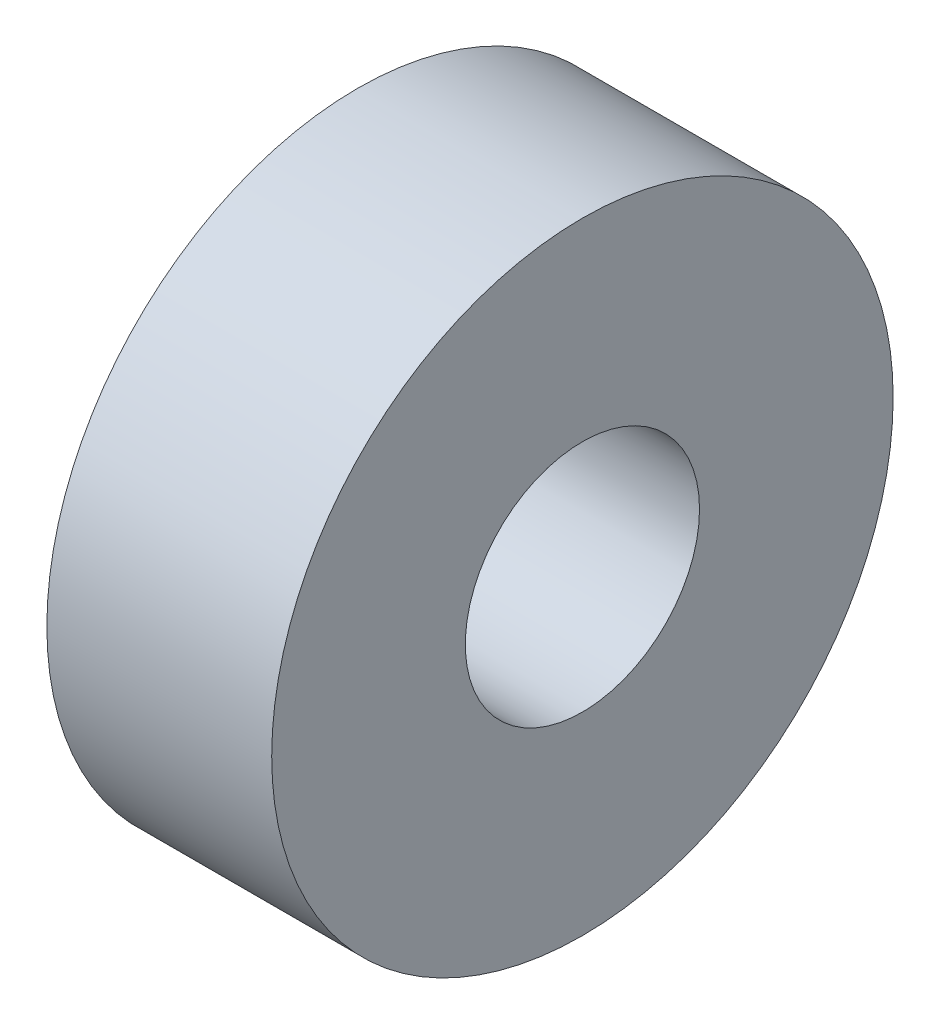
ISO-10303-21;
HEADER;
FILE_DESCRIPTION(('STEP AP214'),'2;1');
FILE_NAME('part.step','',(''),(''),'','','');
FILE_SCHEMA(('AUTOMOTIVE_DESIGN { 1 0 10303 214 1 1 1 1 }'));
ENDSEC;
DATA;
#1=APPLICATION_CONTEXT('core data for automotive mechanical design processes');
#2=APPLICATION_PROTOCOL_DEFINITION('international standard','automotive_design',2000,#1);
#3=PRODUCT_CONTEXT('',#1,'mechanical');
#4=PRODUCT('Part','Part','',(#3));
#5=PRODUCT_RELATED_PRODUCT_CATEGORY('part','',(#4));
#6=PRODUCT_DEFINITION_FORMATION('','',#4);
#7=PRODUCT_DEFINITION_CONTEXT('part definition',#1,'design');
#8=PRODUCT_DEFINITION('design','',#6,#7);
#9=PRODUCT_DEFINITION_SHAPE('','',#8);
#10=(LENGTH_UNIT() NAMED_UNIT(*) SI_UNIT(.MILLI.,.METRE.));
#11=(NAMED_UNIT(*) PLANE_ANGLE_UNIT() SI_UNIT($,.RADIAN.));
#12=(NAMED_UNIT(*) SI_UNIT($,.STERADIAN.) SOLID_ANGLE_UNIT());
#13=UNCERTAINTY_MEASURE_WITH_UNIT(LENGTH_MEASURE(1.E-05),#10,'distance_accuracy_value','');
#14=(GEOMETRIC_REPRESENTATION_CONTEXT(3) GLOBAL_UNCERTAINTY_ASSIGNED_CONTEXT((#13)) GLOBAL_UNIT_ASSIGNED_CONTEXT((#10,
#11,#12)) REPRESENTATION_CONTEXT('',''));
#15=CARTESIAN_POINT('',(0.,0.,0.));
#16=DIRECTION('',(0.,0.,1.));
#17=DIRECTION('',(1.,0.,0.));
#18=AXIS2_PLACEMENT_3D('',#15,#16,#17);
#19=CARTESIAN_POINT('',(9.144,14.7910672197327,30.6481001758243));
#20=DIRECTION('',(-1.,0.,0.));
#21=DIRECTION('',(0.,0.,1.));
#22=AXIS2_PLACEMENT_3D('',#19,#20,#21);
#23=CYLINDRICAL_SURFACE('',#22,12.6365);
#24=CARTESIAN_POINT('',(9.144,14.7910672197327,30.6481001758243));
#25=DIRECTION('',(1.,0.,0.));
#26=DIRECTION('',(0.,0.,-1.));
#27=AXIS2_PLACEMENT_3D('',#24,#25,#26);
#28=CIRCLE('',#27,12.6365);
#29=CARTESIAN_POINT('',(9.144,14.7910672197327,18.0116001758243));
#30=VERTEX_POINT('',#29);
#31=EDGE_CURVE('E10',#30,#30,#28,.T.);
#32=ORIENTED_EDGE('',*,*,#31,.F.);
#33=EDGE_LOOP('',(#32));
#34=FACE_BOUND('',#33,.T.);
#35=CARTESIAN_POINT('',(0.,14.7910672197327,30.6481001758243));
#36=DIRECTION('',(1.,0.,0.));
#37=DIRECTION('',(0.,0.,-1.));
#38=AXIS2_PLACEMENT_3D('',#35,#36,#37);
#39=CIRCLE('',#38,12.6365);
#40=CARTESIAN_POINT('',(0.,14.7910672197327,18.0116001758243));
#41=VERTEX_POINT('',#40);
#42=EDGE_CURVE('E38',#41,#41,#39,.T.);
#43=ORIENTED_EDGE('',*,*,#42,.T.);
#44=EDGE_LOOP('',(#43));
#45=FACE_BOUND('',#44,.T.);
#46=ADVANCED_FACE('F35',(#34,#45),#23,.T.);
#47=CARTESIAN_POINT('',(9.144,14.7910672197327,30.6481001758243));
#48=DIRECTION('',(1.,0.,0.));
#49=DIRECTION('',(0.,0.,-1.));
#50=AXIS2_PLACEMENT_3D('',#47,#48,#49);
#51=PLANE('',#50);
#52=CARTESIAN_POINT('',(9.144,14.7910672197327,30.6481001758243));
#53=DIRECTION('',(1.,0.,0.));
#54=DIRECTION('',(0.,0.,-1.));
#55=AXIS2_PLACEMENT_3D('',#52,#53,#54);
#56=CIRCLE('',#55,4.7625);
#57=CARTESIAN_POINT('',(9.144,14.7910672197327,25.8856001758243));
#58=VERTEX_POINT('',#57);
#59=EDGE_CURVE('E47',#58,#58,#56,.T.);
#60=ORIENTED_EDGE('',*,*,#59,.F.);
#61=EDGE_LOOP('',(#60));
#62=FACE_BOUND('',#61,.T.);
#63=ORIENTED_EDGE('',*,*,#31,.T.);
#64=EDGE_LOOP('',(#63));
#65=FACE_BOUND('',#64,.T.);
#66=ADVANCED_FACE('F62',(#62,#65),#51,.T.);
#67=CARTESIAN_POINT('',(0.,14.7910672197327,30.6481001758243));
#68=DIRECTION('',(1.,0.,0.));
#69=DIRECTION('',(0.,0.,-1.));
#70=AXIS2_PLACEMENT_3D('',#67,#68,#69);
#71=PLANE('',#70);
#72=CARTESIAN_POINT('',(0.,14.7910672197327,30.6481001758243));
#73=DIRECTION('',(1.,0.,0.));
#74=DIRECTION('',(0.,0.,-1.));
#75=AXIS2_PLACEMENT_3D('',#72,#73,#74);
#76=CIRCLE('',#75,4.7625);
#77=CARTESIAN_POINT('',(0.,14.7910672197327,25.8856001758243));
#78=VERTEX_POINT('',#77);
#79=EDGE_CURVE('E45',#78,#78,#76,.T.);
#80=ORIENTED_EDGE('',*,*,#79,.T.);
#81=EDGE_LOOP('',(#80));
#82=FACE_BOUND('',#81,.T.);
#83=ORIENTED_EDGE('',*,*,#42,.F.);
#84=EDGE_LOOP('',(#83));
#85=FACE_BOUND('',#84,.T.);
#86=ADVANCED_FACE('F53',(#82,#85),#71,.F.);
#87=CARTESIAN_POINT('',(0.,14.7910672197327,30.6481001758243));
#88=DIRECTION('',(1.,0.,0.));
#89=DIRECTION('',(0.,0.,-1.));
#90=AXIS2_PLACEMENT_3D('',#87,#88,#89);
#91=CYLINDRICAL_SURFACE('',#90,4.7625);
#92=ORIENTED_EDGE('',*,*,#79,.F.);
#93=EDGE_LOOP('',(#92));
#94=FACE_BOUND('',#93,.T.);
#95=ORIENTED_EDGE('',*,*,#59,.T.);
#96=EDGE_LOOP('',(#95));
#97=FACE_BOUND('',#96,.T.);
#98=ADVANCED_FACE('F56',(#94,#97),#91,.F.);
#99=CLOSED_SHELL('',(#46,#66,#86,#98));
#100=MANIFOLD_SOLID_BREP('B2',#99);
#101=ADVANCED_BREP_SHAPE_REPRESENTATION('',(#18,#100),#14);
#102=SHAPE_DEFINITION_REPRESENTATION(#9,#101);
ENDSEC;
END-ISO-10303-21;
